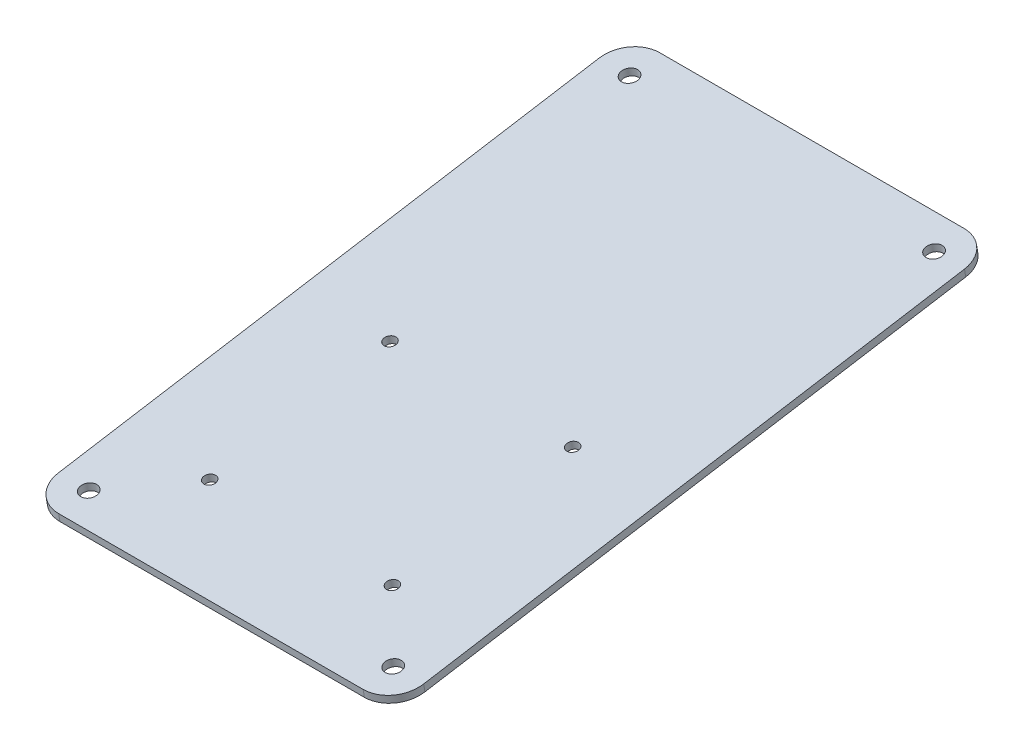
ISO-10303-21;
HEADER;
FILE_DESCRIPTION(('STEP AP214'),'2;1');
FILE_NAME('part.step','',(''),(''),'','','');
FILE_SCHEMA(('AUTOMOTIVE_DESIGN { 1 0 10303 214 1 1 1 1 }'));
ENDSEC;
DATA;
#1=APPLICATION_CONTEXT('core data for automotive mechanical design processes');
#2=APPLICATION_PROTOCOL_DEFINITION('international standard','automotive_design',2000,#1);
#3=PRODUCT_CONTEXT('',#1,'mechanical');
#4=PRODUCT('Part','Part','',(#3));
#5=PRODUCT_RELATED_PRODUCT_CATEGORY('part','',(#4));
#6=PRODUCT_DEFINITION_FORMATION('','',#4);
#7=PRODUCT_DEFINITION_CONTEXT('part definition',#1,'design');
#8=PRODUCT_DEFINITION('design','',#6,#7);
#9=PRODUCT_DEFINITION_SHAPE('','',#8);
#10=(LENGTH_UNIT() NAMED_UNIT(*) SI_UNIT(.MILLI.,.METRE.));
#11=(NAMED_UNIT(*) PLANE_ANGLE_UNIT() SI_UNIT($,.RADIAN.));
#12=(NAMED_UNIT(*) SI_UNIT($,.STERADIAN.) SOLID_ANGLE_UNIT());
#13=UNCERTAINTY_MEASURE_WITH_UNIT(LENGTH_MEASURE(1.E-05),#10,'distance_accuracy_value','');
#14=(GEOMETRIC_REPRESENTATION_CONTEXT(3) GLOBAL_UNCERTAINTY_ASSIGNED_CONTEXT((#13)) GLOBAL_UNIT_ASSIGNED_CONTEXT((#10,
#11,#12)) REPRESENTATION_CONTEXT('',''));
#15=CARTESIAN_POINT('',(0.,0.,0.));
#16=DIRECTION('',(0.,0.,1.));
#17=DIRECTION('',(1.,0.,0.));
#18=AXIS2_PLACEMENT_3D('',#15,#16,#17);
#19=CARTESIAN_POINT('',(63.499999999944,538.348106001962,1040.2545539791));
#20=DIRECTION('',(0.,-0.986762512438189,-0.162171958262434));
#21=DIRECTION('',(0.,0.162171958262434,-0.986762512438189));
#22=AXIS2_PLACEMENT_3D('',#19,#20,#21);
#23=CYLINDRICAL_SURFACE('',#22,12.7000000000559);
#24=CARTESIAN_POINT('',(63.499999999944,535.21513502497,1039.73965801161));
#25=DIRECTION('',(0.,0.986762512438189,0.162171958262434));
#26=DIRECTION('',(0.,0.162171958262434,-0.986762512438189));
#27=AXIS2_PLACEMENT_3D('',#24,#25,#26);
#28=CIRCLE('',#27,12.7000000000559);
#29=CARTESIAN_POINT('',(76.1999999999999,535.21513502497,1039.73965801161));
#30=VERTEX_POINT('',#29);
#31=CARTESIAN_POINT('',(63.499999999944,537.274718894912,1027.20777410359));
#32=VERTEX_POINT('',#31);
#33=EDGE_CURVE('E137',#30,#32,#28,.T.);
#34=ORIENTED_EDGE('',*,*,#33,.T.);
#35=DIRECTION('',(0.,-0.986762512438189,-0.162171958262434));
#36=VECTOR('',#35,1.);
#37=CARTESIAN_POINT('',(63.499999999944,540.407689871904,1027.72267007108));
#38=LINE('',#37,#36);
#39=CARTESIAN_POINT('',(63.499999999944,540.407689871904,1027.72267007108));
#40=VERTEX_POINT('',#39);
#41=EDGE_CURVE('E11',#40,#32,#38,.T.);
#42=ORIENTED_EDGE('',*,*,#41,.F.);
#43=CARTESIAN_POINT('',(63.499999999944,538.348106001962,1040.2545539791));
#44=DIRECTION('',(0.,0.986762512438189,0.162171958262434));
#45=DIRECTION('',(0.,0.162171958262434,-0.986762512438189));
#46=AXIS2_PLACEMENT_3D('',#43,#44,#45);
#47=CIRCLE('',#46,12.7000000000559);
#48=CARTESIAN_POINT('',(76.1999999999999,538.348106001962,1040.2545539791));
#49=VERTEX_POINT('',#48);
#50=EDGE_CURVE('E152',#49,#40,#47,.T.);
#51=ORIENTED_EDGE('',*,*,#50,.F.);
#52=DIRECTION('',(0.,-0.986762512438189,-0.162171958262434));
#53=VECTOR('',#52,1.);
#54=CARTESIAN_POINT('',(76.1999999999999,538.348106001962,1040.2545539791));
#55=LINE('',#54,#53);
#56=EDGE_CURVE('E133',#49,#30,#55,.T.);
#57=ORIENTED_EDGE('',*,*,#56,.T.);
#58=EDGE_LOOP('',(#34,#42,#51,#57));
#59=FACE_BOUND('',#58,.T.);
#60=ADVANCED_FACE('F39',(#59),#23,.T.);
#61=CARTESIAN_POINT('',(-63.4999999999442,540.407689871904,1027.72267007108));
#62=DIRECTION('',(0.,-0.162171958262434,0.986762512438189));
#63=DIRECTION('',(0.,-0.986762512438189,-0.162171958262434));
#64=AXIS2_PLACEMENT_3D('',#61,#62,#63);
#65=PLANE('',#64);
#66=DIRECTION('',(-1.,0.,0.));
#67=VECTOR('',#66,1.);
#68=CARTESIAN_POINT('',(-63.4999999999442,537.274718894912,1027.20777410359));
#69=LINE('',#68,#67);
#70=CARTESIAN_POINT('',(-63.4999999999442,537.274718894912,1027.20777410359));
#71=VERTEX_POINT('',#70);
#72=EDGE_CURVE('E140',#32,#71,#69,.T.);
#73=ORIENTED_EDGE('',*,*,#72,.T.);
#74=DIRECTION('',(0.,-0.986762512438189,-0.162171958262434));
#75=VECTOR('',#74,1.);
#76=CARTESIAN_POINT('',(-63.4999999999442,540.407689871904,1027.72267007108));
#77=LINE('',#76,#75);
#78=CARTESIAN_POINT('',(-63.4999999999442,540.407689871904,1027.72267007108));
#79=VERTEX_POINT('',#78);
#80=EDGE_CURVE('E48',#79,#71,#77,.T.);
#81=ORIENTED_EDGE('',*,*,#80,.F.);
#82=DIRECTION('',(-1.,0.,0.));
#83=VECTOR('',#82,1.);
#84=CARTESIAN_POINT('',(-63.4999999999442,540.407689871904,1027.72267007108));
#85=LINE('',#84,#83);
#86=EDGE_CURVE('E100',#40,#79,#85,.T.);
#87=ORIENTED_EDGE('',*,*,#86,.F.);
#88=ORIENTED_EDGE('',*,*,#41,.T.);
#89=EDGE_LOOP('',(#73,#81,#87,#88));
#90=FACE_BOUND('',#89,.T.);
#91=ADVANCED_FACE('F246',(#90),#65,.F.);
#92=CARTESIAN_POINT('',(-63.4999999999442,538.348106001962,1040.2545539791));
#93=DIRECTION('',(0.,-0.986762512438189,-0.162171958262434));
#94=DIRECTION('',(0.,0.162171958262434,-0.986762512438189));
#95=AXIS2_PLACEMENT_3D('',#92,#93,#94);
#96=CYLINDRICAL_SURFACE('',#95,12.7000000000559);
#97=CARTESIAN_POINT('',(-63.4999999999442,535.215135024971,1039.73965801161));
#98=DIRECTION('',(0.,0.986762512438189,0.162171958262434));
#99=DIRECTION('',(0.,0.162171958262434,-0.986762512438189));
#100=AXIS2_PLACEMENT_3D('',#97,#98,#99);
#101=CIRCLE('',#100,12.7000000000559);
#102=CARTESIAN_POINT('',(-76.2000000000001,535.215135024971,1039.73965801161));
#103=VERTEX_POINT('',#102);
#104=EDGE_CURVE('E143',#71,#103,#101,.T.);
#105=ORIENTED_EDGE('',*,*,#104,.T.);
#106=DIRECTION('',(0.,-0.986762512438189,-0.162171958262434));
#107=VECTOR('',#106,1.);
#108=CARTESIAN_POINT('',(-76.2000000000001,538.348106001962,1040.2545539791));
#109=LINE('',#108,#107);
#110=CARTESIAN_POINT('',(-76.2000000000001,538.348106001962,1040.2545539791));
#111=VERTEX_POINT('',#110);
#112=EDGE_CURVE('E159',#111,#103,#109,.T.);
#113=ORIENTED_EDGE('',*,*,#112,.F.);
#114=CARTESIAN_POINT('',(-63.4999999999442,538.348106001962,1040.2545539791));
#115=DIRECTION('',(0.,0.986762512438189,0.162171958262434));
#116=DIRECTION('',(0.,0.162171958262434,-0.986762512438189));
#117=AXIS2_PLACEMENT_3D('',#114,#115,#116);
#118=CIRCLE('',#117,12.7000000000559);
#119=EDGE_CURVE('E213',#79,#111,#118,.T.);
#120=ORIENTED_EDGE('',*,*,#119,.F.);
#121=ORIENTED_EDGE('',*,*,#80,.T.);
#122=EDGE_LOOP('',(#105,#113,#120,#121));
#123=FACE_BOUND('',#122,.T.);
#124=ADVANCED_FACE('F250',(#123),#96,.T.);
#125=CARTESIAN_POINT('',(-76.2000000000001,501.275596343188,1265.82846432236));
#126=DIRECTION('',(1.,0.,0.));
#127=DIRECTION('',(0.,1.,0.));
#128=AXIS2_PLACEMENT_3D('',#125,#126,#127);
#129=PLANE('',#128);
#130=DIRECTION('',(0.,-0.162171958262434,0.986762512438189));
#131=VECTOR('',#130,1.);
#132=CARTESIAN_POINT('',(-76.2000000000001,498.142625366196,1265.31356835487));
#133=LINE('',#132,#131);
#134=CARTESIAN_POINT('',(-76.2000000000001,498.142625366196,1265.31356835487));
#135=VERTEX_POINT('',#134);
#136=EDGE_CURVE('E145',#103,#135,#133,.T.);
#137=ORIENTED_EDGE('',*,*,#136,.T.);
#138=DIRECTION('',(0.,-0.986762512438189,-0.162171958262434));
#139=VECTOR('',#138,1.);
#140=CARTESIAN_POINT('',(-76.2000000000001,501.275596343188,1265.82846432236));
#141=LINE('',#140,#139);
#142=CARTESIAN_POINT('',(-76.2000000000001,501.275596343188,1265.82846432236));
#143=VERTEX_POINT('',#142);
#144=EDGE_CURVE('E156',#143,#135,#141,.T.);
#145=ORIENTED_EDGE('',*,*,#144,.F.);
#146=DIRECTION('',(0.,-0.162171958262434,0.986762512438189));
#147=VECTOR('',#146,1.);
#148=CARTESIAN_POINT('',(-76.2000000000001,501.275596343188,1265.82846432236));
#149=LINE('',#148,#147);
#150=EDGE_CURVE('E215',#111,#143,#149,.T.);
#151=ORIENTED_EDGE('',*,*,#150,.F.);
#152=ORIENTED_EDGE('',*,*,#112,.T.);
#153=EDGE_LOOP('',(#137,#145,#151,#152));
#154=FACE_BOUND('',#153,.T.);
#155=ADVANCED_FACE('F221',(#154),#129,.F.);
#156=CARTESIAN_POINT('',(-63.4999999999442,501.275596343188,1265.82846432236));
#157=DIRECTION('',(0.,-0.986762512438189,-0.162171958262434));
#158=DIRECTION('',(0.,0.162171958262434,-0.986762512438189));
#159=AXIS2_PLACEMENT_3D('',#156,#157,#158);
#160=CYLINDRICAL_SURFACE('',#159,12.7000000000559);
#161=CARTESIAN_POINT('',(-63.4999999999442,498.142625366196,1265.31356835487));
#162=DIRECTION('',(0.,0.986762512438189,0.162171958262434));
#163=DIRECTION('',(0.,-0.162171958262434,0.986762512438189));
#164=AXIS2_PLACEMENT_3D('',#161,#162,#163);
#165=CIRCLE('',#164,12.7000000000559);
#166=CARTESIAN_POINT('',(-63.4999999999442,496.083041496254,1277.84545226289));
#167=VERTEX_POINT('',#166);
#168=EDGE_CURVE('E147',#135,#167,#165,.T.);
#169=ORIENTED_EDGE('',*,*,#168,.T.);
#170=DIRECTION('',(0.,-0.986762512438189,-0.162171958262434));
#171=VECTOR('',#170,1.);
#172=CARTESIAN_POINT('',(-63.4999999999442,499.216012473246,1278.36034823038));
#173=LINE('',#172,#171);
#174=CARTESIAN_POINT('',(-63.4999999999442,499.216012473246,1278.36034823038));
#175=VERTEX_POINT('',#174);
#176=EDGE_CURVE('E128',#175,#167,#173,.T.);
#177=ORIENTED_EDGE('',*,*,#176,.F.);
#178=CARTESIAN_POINT('',(-63.4999999999442,501.275596343188,1265.82846432236));
#179=DIRECTION('',(0.,0.986762512438189,0.162171958262434));
#180=DIRECTION('',(0.,-0.162171958262434,0.986762512438189));
#181=AXIS2_PLACEMENT_3D('',#178,#179,#180);
#182=CIRCLE('',#181,12.7000000000559);
#183=EDGE_CURVE('E119',#143,#175,#182,.T.);
#184=ORIENTED_EDGE('',*,*,#183,.F.);
#185=ORIENTED_EDGE('',*,*,#144,.T.);
#186=EDGE_LOOP('',(#169,#177,#184,#185));
#187=FACE_BOUND('',#186,.T.);
#188=ADVANCED_FACE('F225',(#187),#160,.T.);
#189=CARTESIAN_POINT('',(-63.4999999999442,499.216012473246,1278.36034823038));
#190=DIRECTION('',(0.,0.162171958262434,-0.986762512438189));
#191=DIRECTION('',(0.,0.986762512438189,0.162171958262434));
#192=AXIS2_PLACEMENT_3D('',#189,#190,#191);
#193=PLANE('',#192);
#194=DIRECTION('',(1.,0.,0.));
#195=VECTOR('',#194,1.);
#196=CARTESIAN_POINT('',(-63.4999999999442,496.083041496254,1277.84545226289));
#197=LINE('',#196,#195);
#198=CARTESIAN_POINT('',(63.4999999999439,496.083041496254,1277.84545226289));
#199=VERTEX_POINT('',#198);
#200=EDGE_CURVE('E127',#167,#199,#197,.T.);
#201=ORIENTED_EDGE('',*,*,#200,.T.);
#202=DIRECTION('',(0.,-0.986762512438189,-0.162171958262434));
#203=VECTOR('',#202,1.);
#204=CARTESIAN_POINT('',(63.4999999999439,499.216012473246,1278.36034823038));
#205=LINE('',#204,#203);
#206=CARTESIAN_POINT('',(63.4999999999439,499.216012473246,1278.36034823038));
#207=VERTEX_POINT('',#206);
#208=EDGE_CURVE('E124',#207,#199,#205,.T.);
#209=ORIENTED_EDGE('',*,*,#208,.F.);
#210=DIRECTION('',(1.,0.,0.));
#211=VECTOR('',#210,1.);
#212=CARTESIAN_POINT('',(-63.4999999999442,499.216012473246,1278.36034823038));
#213=LINE('',#212,#211);
#214=EDGE_CURVE('E113',#175,#207,#213,.T.);
#215=ORIENTED_EDGE('',*,*,#214,.F.);
#216=ORIENTED_EDGE('',*,*,#176,.T.);
#217=EDGE_LOOP('',(#201,#209,#215,#216));
#218=FACE_BOUND('',#217,.T.);
#219=ADVANCED_FACE('F125',(#218),#193,.F.);
#220=CARTESIAN_POINT('',(63.4999999999439,501.275596343188,1265.82846432236));
#221=DIRECTION('',(0.,-0.986762512438189,-0.162171958262434));
#222=DIRECTION('',(0.,0.162171958262434,-0.986762512438189));
#223=AXIS2_PLACEMENT_3D('',#220,#221,#222);
#224=CYLINDRICAL_SURFACE('',#223,12.7000000000562);
#225=CARTESIAN_POINT('',(63.4999999999439,498.142625366196,1265.31356835487));
#226=DIRECTION('',(0.,0.986762512438189,0.162171958262434));
#227=DIRECTION('',(0.,0.162171958262434,-0.986762512438189));
#228=AXIS2_PLACEMENT_3D('',#225,#226,#227);
#229=CIRCLE('',#228,12.7000000000562);
#230=CARTESIAN_POINT('',(76.2000000000001,498.142625366196,1265.31356835487));
#231=VERTEX_POINT('',#230);
#232=EDGE_CURVE('E86',#199,#231,#229,.T.);
#233=ORIENTED_EDGE('',*,*,#232,.T.);
#234=DIRECTION('',(0.,-0.986762512438189,-0.162171958262434));
#235=VECTOR('',#234,1.);
#236=CARTESIAN_POINT('',(76.2000000000001,501.275596343188,1265.82846432236));
#237=LINE('',#236,#235);
#238=CARTESIAN_POINT('',(76.2000000000001,501.275596343188,1265.82846432236));
#239=VERTEX_POINT('',#238);
#240=EDGE_CURVE('E129',#239,#231,#237,.T.);
#241=ORIENTED_EDGE('',*,*,#240,.F.);
#242=CARTESIAN_POINT('',(63.4999999999439,501.275596343188,1265.82846432236));
#243=DIRECTION('',(0.,0.986762512438189,0.162171958262434));
#244=DIRECTION('',(0.,0.162171958262434,-0.986762512438189));
#245=AXIS2_PLACEMENT_3D('',#242,#243,#244);
#246=CIRCLE('',#245,12.7000000000562);
#247=EDGE_CURVE('E117',#207,#239,#246,.T.);
#248=ORIENTED_EDGE('',*,*,#247,.F.);
#249=ORIENTED_EDGE('',*,*,#208,.T.);
#250=EDGE_LOOP('',(#233,#241,#248,#249));
#251=FACE_BOUND('',#250,.T.);
#252=ADVANCED_FACE('F131',(#251),#224,.T.);
#253=CARTESIAN_POINT('',(76.1999999999999,501.275596343188,1265.82846432236));
#254=DIRECTION('',(-1.,0.,0.));
#255=DIRECTION('',(0.,-1.,0.));
#256=AXIS2_PLACEMENT_3D('',#253,#254,#255);
#257=PLANE('',#256);
#258=DIRECTION('',(0.,0.162171958262434,-0.986762512438189));
#259=VECTOR('',#258,1.);
#260=CARTESIAN_POINT('',(76.1999999999999,498.142625366196,1265.31356835487));
#261=LINE('',#260,#259);
#262=EDGE_CURVE('E92',#231,#30,#261,.T.);
#263=ORIENTED_EDGE('',*,*,#262,.T.);
#264=ORIENTED_EDGE('',*,*,#56,.F.);
#265=DIRECTION('',(0.,0.162171958262434,-0.986762512438189));
#266=VECTOR('',#265,1.);
#267=CARTESIAN_POINT('',(76.1999999999999,501.275596343188,1265.82846432236));
#268=LINE('',#267,#266);
#269=EDGE_CURVE('E57',#239,#49,#268,.T.);
#270=ORIENTED_EDGE('',*,*,#269,.F.);
#271=ORIENTED_EDGE('',*,*,#240,.T.);
#272=EDGE_LOOP('',(#263,#264,#270,#271));
#273=FACE_BOUND('',#272,.T.);
#274=ADVANCED_FACE('F233',(#273),#257,.F.);
#275=CARTESIAN_POINT('',(63.499999999944,538.348106001962,1040.2545539791));
#276=DIRECTION('',(0.,-0.986762512438189,-0.162171958262434));
#277=DIRECTION('',(0.,0.162171958262434,-0.986762512438189));
#278=AXIS2_PLACEMENT_3D('',#275,#276,#277);
#279=PLANE('',#278);
#280=CARTESIAN_POINT('',(38.1,505.394764083045,1240.76469650648));
#281=DIRECTION('',(0.,0.986762512438189,0.162171958262434));
#282=DIRECTION('',(0.,-0.162171958262434,0.986762512438189));
#283=AXIS2_PLACEMENT_3D('',#280,#281,#282);
#284=CIRCLE('',#283,2.45744999999999);
#285=CARTESIAN_POINT('',(38.1,504.996234604213,1243.18961604267));
#286=VERTEX_POINT('',#285);
#287=EDGE_CURVE('E198',#286,#286,#284,.T.);
#288=ORIENTED_EDGE('',*,*,#287,.F.);
#289=EDGE_LOOP('',(#288));
#290=FACE_BOUND('',#289,.T.);
#291=CARTESIAN_POINT('',(-38.1,505.394764083045,1240.76469650648));
#292=DIRECTION('',(0.,0.986762512438189,0.162171958262434));
#293=DIRECTION('',(0.,-0.162171958262434,0.986762512438189));
#294=AXIS2_PLACEMENT_3D('',#291,#292,#293);
#295=CIRCLE('',#294,2.45744999999999);
#296=CARTESIAN_POINT('',(-38.1,504.996234604213,1243.18961604267));
#297=VERTEX_POINT('',#296);
#298=EDGE_CURVE('E188',#297,#297,#295,.T.);
#299=ORIENTED_EDGE('',*,*,#298,.F.);
#300=EDGE_LOOP('',(#299));
#301=FACE_BOUND('',#300,.T.);
#302=CARTESIAN_POINT('',(38.1,517.752267302643,1165.57339305869));
#303=DIRECTION('',(0.,0.986762512438189,0.162171958262434));
#304=DIRECTION('',(0.,-0.162171958262434,0.986762512438189));
#305=AXIS2_PLACEMENT_3D('',#302,#303,#304);
#306=CIRCLE('',#305,2.45744999999999);
#307=CARTESIAN_POINT('',(38.1,517.353737823811,1167.99831259488));
#308=VERTEX_POINT('',#307);
#309=EDGE_CURVE('E185',#308,#308,#306,.T.);
#310=ORIENTED_EDGE('',*,*,#309,.F.);
#311=EDGE_LOOP('',(#310));
#312=FACE_BOUND('',#311,.T.);
#313=CARTESIAN_POINT('',(-38.1,517.752267302643,1165.57339305869));
#314=DIRECTION('',(0.,0.986762512438189,0.162171958262434));
#315=DIRECTION('',(0.,-0.162171958262434,0.986762512438189));
#316=AXIS2_PLACEMENT_3D('',#313,#314,#315);
#317=CIRCLE('',#316,2.45744999999999);
#318=CARTESIAN_POINT('',(-38.1,517.353737823811,1167.99831259488));
#319=VERTEX_POINT('',#318);
#320=EDGE_CURVE('E182',#319,#319,#317,.T.);
#321=ORIENTED_EDGE('',*,*,#320,.F.);
#322=EDGE_LOOP('',(#321));
#323=FACE_BOUND('',#322,.T.);
#324=CARTESIAN_POINT('',(-63.4999999999439,501.275596343189,1265.82846432235));
#325=DIRECTION('',(0.,0.986762512438189,0.162171958262434));
#326=DIRECTION('',(0.,-0.162171958262434,0.986762512438189));
#327=AXIS2_PLACEMENT_3D('',#324,#325,#326);
#328=CIRCLE('',#327,3.37819999999998);
#329=CARTESIAN_POINT('',(-63.4999999999439,500.727747033787,1269.16194544187));
#330=VERTEX_POINT('',#329);
#331=EDGE_CURVE('E178',#330,#330,#328,.T.);
#332=ORIENTED_EDGE('',*,*,#331,.F.);
#333=EDGE_LOOP('',(#332));
#334=FACE_BOUND('',#333,.T.);
#335=CARTESIAN_POINT('',(63.4999999999439,501.275596343189,1265.82846432235));
#336=DIRECTION('',(0.,0.986762512438189,0.162171958262434));
#337=DIRECTION('',(0.,-0.162171958262434,0.986762512438189));
#338=AXIS2_PLACEMENT_3D('',#335,#336,#337);
#339=CIRCLE('',#338,3.37819999999998);
#340=CARTESIAN_POINT('',(63.4999999999439,500.727747033787,1269.16194544187));
#341=VERTEX_POINT('',#340);
#342=EDGE_CURVE('E174',#341,#341,#339,.T.);
#343=ORIENTED_EDGE('',*,*,#342,.F.);
#344=EDGE_LOOP('',(#343));
#345=FACE_BOUND('',#344,.T.);
#346=CARTESIAN_POINT('',(63.4999999999439,538.348106001963,1040.2545539791));
#347=DIRECTION('',(0.,0.986762512438189,0.162171958262434));
#348=DIRECTION('',(0.,-0.162171958262434,0.986762512438189));
#349=AXIS2_PLACEMENT_3D('',#346,#347,#348);
#350=CIRCLE('',#349,3.37819999999998);
#351=CARTESIAN_POINT('',(63.4999999999439,537.800256692561,1043.58803509861));
#352=VERTEX_POINT('',#351);
#353=EDGE_CURVE('E170',#352,#352,#350,.T.);
#354=ORIENTED_EDGE('',*,*,#353,.F.);
#355=EDGE_LOOP('',(#354));
#356=FACE_BOUND('',#355,.T.);
#357=CARTESIAN_POINT('',(-63.4999999999438,538.348106001963,1040.2545539791));
#358=DIRECTION('',(0.,0.986762512438189,0.162171958262434));
#359=DIRECTION('',(0.,-0.162171958262434,0.986762512438189));
#360=AXIS2_PLACEMENT_3D('',#357,#358,#359);
#361=CIRCLE('',#360,3.37819999999998);
#362=CARTESIAN_POINT('',(-63.4999999999438,537.800256692561,1043.58803509861));
#363=VERTEX_POINT('',#362);
#364=EDGE_CURVE('E166',#363,#363,#361,.T.);
#365=ORIENTED_EDGE('',*,*,#364,.F.);
#366=EDGE_LOOP('',(#365));
#367=FACE_BOUND('',#366,.T.);
#368=ORIENTED_EDGE('',*,*,#50,.T.);
#369=ORIENTED_EDGE('',*,*,#86,.T.);
#370=ORIENTED_EDGE('',*,*,#119,.T.);
#371=ORIENTED_EDGE('',*,*,#150,.T.);
#372=ORIENTED_EDGE('',*,*,#183,.T.);
#373=ORIENTED_EDGE('',*,*,#214,.T.);
#374=ORIENTED_EDGE('',*,*,#247,.T.);
#375=ORIENTED_EDGE('',*,*,#269,.T.);
#376=EDGE_LOOP('',(#368,#369,#370,#371,#372,#373,#374,#375));
#377=FACE_BOUND('',#376,.T.);
#378=ADVANCED_FACE('F115',(#290,#301,#312,#323,#334,#345,#356,#367,#377),#279,.F.);
#379=CARTESIAN_POINT('',(63.499999999944,535.21513502497,1039.73965801161));
#380=DIRECTION('',(0.,-0.986762512438189,-0.162171958262434));
#381=DIRECTION('',(0.,0.162171958262434,-0.986762512438189));
#382=AXIS2_PLACEMENT_3D('',#379,#380,#381);
#383=PLANE('',#382);
#384=CARTESIAN_POINT('',(38.1,502.261793106053,1240.249800539));
#385=DIRECTION('',(0.,-0.986762512438189,-0.162171958262434));
#386=DIRECTION('',(0.,0.162171958262434,-0.986762512438189));
#387=AXIS2_PLACEMENT_3D('',#384,#385,#386);
#388=CIRCLE('',#387,2.45744999999999);
#389=CARTESIAN_POINT('',(38.1,501.863263627221,1242.67472007519));
#390=VERTEX_POINT('',#389);
#391=EDGE_CURVE('E42',#390,#390,#388,.T.);
#392=ORIENTED_EDGE('',*,*,#391,.F.);
#393=EDGE_LOOP('',(#392));
#394=FACE_BOUND('',#393,.T.);
#395=CARTESIAN_POINT('',(-38.1,502.261793106053,1240.249800539));
#396=DIRECTION('',(0.,-0.986762512438189,-0.162171958262434));
#397=DIRECTION('',(0.,0.162171958262434,-0.986762512438189));
#398=AXIS2_PLACEMENT_3D('',#395,#396,#397);
#399=CIRCLE('',#398,2.45744999999999);
#400=CARTESIAN_POINT('',(-38.1,501.863263627221,1242.67472007519));
#401=VERTEX_POINT('',#400);
#402=EDGE_CURVE('E186',#401,#401,#399,.T.);
#403=ORIENTED_EDGE('',*,*,#402,.F.);
#404=EDGE_LOOP('',(#403));
#405=FACE_BOUND('',#404,.T.);
#406=CARTESIAN_POINT('',(38.1,514.619296325651,1165.05849709121));
#407=DIRECTION('',(0.,-0.986762512438189,-0.162171958262434));
#408=DIRECTION('',(0.,0.162171958262434,-0.986762512438189));
#409=AXIS2_PLACEMENT_3D('',#406,#407,#408);
#410=CIRCLE('',#409,2.45744999999999);
#411=CARTESIAN_POINT('',(38.1,514.220766846819,1167.4834166274));
#412=VERTEX_POINT('',#411);
#413=EDGE_CURVE('E183',#412,#412,#410,.T.);
#414=ORIENTED_EDGE('',*,*,#413,.F.);
#415=EDGE_LOOP('',(#414));
#416=FACE_BOUND('',#415,.T.);
#417=CARTESIAN_POINT('',(-38.1,514.619296325651,1165.05849709121));
#418=DIRECTION('',(0.,-0.986762512438189,-0.162171958262434));
#419=DIRECTION('',(0.,0.162171958262434,-0.986762512438189));
#420=AXIS2_PLACEMENT_3D('',#417,#418,#419);
#421=CIRCLE('',#420,2.45744999999999);
#422=CARTESIAN_POINT('',(-38.1,514.220766846819,1167.4834166274));
#423=VERTEX_POINT('',#422);
#424=EDGE_CURVE('E179',#423,#423,#421,.T.);
#425=ORIENTED_EDGE('',*,*,#424,.F.);
#426=EDGE_LOOP('',(#425));
#427=FACE_BOUND('',#426,.T.);
#428=CARTESIAN_POINT('',(-63.4999999999439,498.142625366197,1265.31356835487));
#429=DIRECTION('',(0.,-0.986762512438189,-0.162171958262434));
#430=DIRECTION('',(0.,0.162171958262434,-0.986762512438189));
#431=AXIS2_PLACEMENT_3D('',#428,#429,#430);
#432=CIRCLE('',#431,3.37819999999998);
#433=CARTESIAN_POINT('',(-63.4999999999439,498.690474675599,1261.98008723535));
#434=VERTEX_POINT('',#433);
#435=EDGE_CURVE('E175',#434,#434,#432,.T.);
#436=ORIENTED_EDGE('',*,*,#435,.F.);
#437=EDGE_LOOP('',(#436));
#438=FACE_BOUND('',#437,.T.);
#439=CARTESIAN_POINT('',(63.4999999999439,498.142625366196,1265.31356835487));
#440=DIRECTION('',(0.,-0.986762512438189,-0.162171958262434));
#441=DIRECTION('',(0.,0.162171958262434,-0.986762512438189));
#442=AXIS2_PLACEMENT_3D('',#439,#440,#441);
#443=CIRCLE('',#442,3.37819999999998);
#444=CARTESIAN_POINT('',(63.4999999999439,498.690474675599,1261.98008723535));
#445=VERTEX_POINT('',#444);
#446=EDGE_CURVE('E171',#445,#445,#443,.T.);
#447=ORIENTED_EDGE('',*,*,#446,.F.);
#448=EDGE_LOOP('',(#447));
#449=FACE_BOUND('',#448,.T.);
#450=CARTESIAN_POINT('',(63.4999999999439,535.215135024971,1039.73965801161));
#451=DIRECTION('',(0.,-0.986762512438189,-0.162171958262434));
#452=DIRECTION('',(0.,0.162171958262434,-0.986762512438189));
#453=AXIS2_PLACEMENT_3D('',#450,#451,#452);
#454=CIRCLE('',#453,3.37819999999998);
#455=CARTESIAN_POINT('',(63.4999999999439,535.762984334373,1036.40617689209));
#456=VERTEX_POINT('',#455);
#457=EDGE_CURVE('E167',#456,#456,#454,.T.);
#458=ORIENTED_EDGE('',*,*,#457,.F.);
#459=EDGE_LOOP('',(#458));
#460=FACE_BOUND('',#459,.T.);
#461=CARTESIAN_POINT('',(-63.4999999999438,535.215135024971,1039.73965801161));
#462=DIRECTION('',(0.,-0.986762512438189,-0.162171958262434));
#463=DIRECTION('',(0.,0.162171958262434,-0.986762512438189));
#464=AXIS2_PLACEMENT_3D('',#461,#462,#463);
#465=CIRCLE('',#464,3.37819999999998);
#466=CARTESIAN_POINT('',(-63.4999999999438,535.762984334373,1036.40617689209));
#467=VERTEX_POINT('',#466);
#468=EDGE_CURVE('E141',#467,#467,#465,.T.);
#469=ORIENTED_EDGE('',*,*,#468,.F.);
#470=EDGE_LOOP('',(#469));
#471=FACE_BOUND('',#470,.T.);
#472=ORIENTED_EDGE('',*,*,#33,.F.);
#473=ORIENTED_EDGE('',*,*,#262,.F.);
#474=ORIENTED_EDGE('',*,*,#232,.F.);
#475=ORIENTED_EDGE('',*,*,#200,.F.);
#476=ORIENTED_EDGE('',*,*,#168,.F.);
#477=ORIENTED_EDGE('',*,*,#136,.F.);
#478=ORIENTED_EDGE('',*,*,#104,.F.);
#479=ORIENTED_EDGE('',*,*,#72,.F.);
#480=EDGE_LOOP('',(#472,#473,#474,#475,#476,#477,#478,#479));
#481=FACE_BOUND('',#480,.T.);
#482=ADVANCED_FACE('F228',(#394,#405,#416,#427,#438,#449,#460,#471,#481),#383,.T.);
#483=CARTESIAN_POINT('',(-63.4999999999438,538.348106001963,1040.2545539791));
#484=DIRECTION('',(0.,0.986762512438189,0.162171958262434));
#485=DIRECTION('',(0.,-0.162171958262434,0.986762512438189));
#486=AXIS2_PLACEMENT_3D('',#483,#484,#485);
#487=CYLINDRICAL_SURFACE('',#486,3.37819999999998);
#488=ORIENTED_EDGE('',*,*,#468,.T.);
#489=EDGE_LOOP('',(#488));
#490=FACE_BOUND('',#489,.T.);
#491=ORIENTED_EDGE('',*,*,#364,.T.);
#492=EDGE_LOOP('',(#491));
#493=FACE_BOUND('',#492,.T.);
#494=ADVANCED_FACE('F292',(#490,#493),#487,.F.);
#495=CARTESIAN_POINT('',(63.4999999999439,538.348106001963,1040.2545539791));
#496=DIRECTION('',(0.,0.986762512438189,0.162171958262434));
#497=DIRECTION('',(0.,-0.162171958262434,0.986762512438189));
#498=AXIS2_PLACEMENT_3D('',#495,#496,#497);
#499=CYLINDRICAL_SURFACE('',#498,3.37819999999998);
#500=ORIENTED_EDGE('',*,*,#457,.T.);
#501=EDGE_LOOP('',(#500));
#502=FACE_BOUND('',#501,.T.);
#503=ORIENTED_EDGE('',*,*,#353,.T.);
#504=EDGE_LOOP('',(#503));
#505=FACE_BOUND('',#504,.T.);
#506=ADVANCED_FACE('F301',(#502,#505),#499,.F.);
#507=CARTESIAN_POINT('',(63.4999999999439,501.275596343189,1265.82846432235));
#508=DIRECTION('',(0.,0.986762512438189,0.162171958262434));
#509=DIRECTION('',(0.,-0.162171958262434,0.986762512438189));
#510=AXIS2_PLACEMENT_3D('',#507,#508,#509);
#511=CYLINDRICAL_SURFACE('',#510,3.37819999999998);
#512=ORIENTED_EDGE('',*,*,#446,.T.);
#513=EDGE_LOOP('',(#512));
#514=FACE_BOUND('',#513,.T.);
#515=ORIENTED_EDGE('',*,*,#342,.T.);
#516=EDGE_LOOP('',(#515));
#517=FACE_BOUND('',#516,.T.);
#518=ADVANCED_FACE('F311',(#514,#517),#511,.F.);
#519=CARTESIAN_POINT('',(-63.4999999999439,501.275596343189,1265.82846432235));
#520=DIRECTION('',(0.,0.986762512438189,0.162171958262434));
#521=DIRECTION('',(0.,-0.162171958262434,0.986762512438189));
#522=AXIS2_PLACEMENT_3D('',#519,#520,#521);
#523=CYLINDRICAL_SURFACE('',#522,3.37819999999998);
#524=ORIENTED_EDGE('',*,*,#435,.T.);
#525=EDGE_LOOP('',(#524));
#526=FACE_BOUND('',#525,.T.);
#527=ORIENTED_EDGE('',*,*,#331,.T.);
#528=EDGE_LOOP('',(#527));
#529=FACE_BOUND('',#528,.T.);
#530=ADVANCED_FACE('F321',(#526,#529),#523,.F.);
#531=CARTESIAN_POINT('',(-38.1,517.752267302643,1165.57339305869));
#532=DIRECTION('',(0.,0.986762512438189,0.162171958262434));
#533=DIRECTION('',(0.,-0.162171958262434,0.986762512438189));
#534=AXIS2_PLACEMENT_3D('',#531,#532,#533);
#535=CYLINDRICAL_SURFACE('',#534,2.45744999999999);
#536=CARTESIAN_POINT('',(-38.1,514.220766846819,1167.4834166274));
#537=CARTESIAN_POINT('',(-38.1,514.253401961162,1167.48878012706));
#538=CARTESIAN_POINT('',(-38.1,514.286037075506,1167.49414362672));
#539=CARTESIAN_POINT('',(-38.1,514.351307304193,1167.50487062604));
#540=CARTESIAN_POINT('',(-38.1,514.383942418537,1167.5102341257));
#541=CARTESIAN_POINT('',(-38.1,514.449212647224,1167.52096112503));
#542=CARTESIAN_POINT('',(-38.1,514.481847761568,1167.52632462469));
#543=CARTESIAN_POINT('',(-38.1,514.547117990255,1167.53705162401));
#544=CARTESIAN_POINT('',(-38.1,514.579753104599,1167.54241512367));
#545=CARTESIAN_POINT('',(-38.1,514.645023333286,1167.553142123));
#546=CARTESIAN_POINT('',(-38.1,514.67765844763,1167.55850562266));
#547=CARTESIAN_POINT('',(-38.1,514.742928676317,1167.56923262198));
#548=CARTESIAN_POINT('',(-38.1,514.775563790661,1167.57459612164));
#549=CARTESIAN_POINT('',(-38.1,514.840834019348,1167.58532312096));
#550=CARTESIAN_POINT('',(-38.1,514.873469133692,1167.59068662062));
#551=CARTESIAN_POINT('',(-38.1,514.938739362379,1167.60141361995));
#552=CARTESIAN_POINT('',(-38.1,514.971374476723,1167.60677711961));
#553=CARTESIAN_POINT('',(-38.1,515.03664470541,1167.61750411893));
#554=CARTESIAN_POINT('',(-38.1,515.069279819754,1167.62286761859));
#555=CARTESIAN_POINT('',(-38.1,515.134550048441,1167.63359461791));
#556=CARTESIAN_POINT('',(-38.1,515.167185162785,1167.63895811758));
#557=CARTESIAN_POINT('',(-38.1,515.232455391472,1167.6496851169));
#558=CARTESIAN_POINT('',(-38.1,515.265090505816,1167.65504861656));
#559=CARTESIAN_POINT('',(-38.1,515.330360734503,1167.66577561588));
#560=CARTESIAN_POINT('',(-38.1,515.362995848847,1167.67113911554));
#561=CARTESIAN_POINT('',(-38.1,515.428266077534,1167.68186611487));
#562=CARTESIAN_POINT('',(-38.1,515.460901191878,1167.68722961453));
#563=CARTESIAN_POINT('',(-38.1,515.526171420565,1167.69795661385));
#564=CARTESIAN_POINT('',(-38.1,515.558806534909,1167.70332011351));
#565=CARTESIAN_POINT('',(-38.1,515.624076763596,1167.71404711283));
#566=CARTESIAN_POINT('',(-38.1,515.65671187794,1167.7194106125));
#567=CARTESIAN_POINT('',(-38.1,515.721982106627,1167.73013761182));
#568=CARTESIAN_POINT('',(-38.1,515.754617220971,1167.73550111148));
#569=CARTESIAN_POINT('',(-38.1,515.819887449659,1167.7462281108));
#570=CARTESIAN_POINT('',(-38.1,515.852522564002,1167.75159161046));
#571=CARTESIAN_POINT('',(-38.1,515.91779279269,1167.76231860979));
#572=CARTESIAN_POINT('',(-38.1,515.950427907033,1167.76768210945));
#573=CARTESIAN_POINT('',(-38.1,516.015698135721,1167.77840910877));
#574=CARTESIAN_POINT('',(-38.1,516.048333250064,1167.78377260843));
#575=CARTESIAN_POINT('',(-38.1,516.113603478752,1167.79449960775));
#576=CARTESIAN_POINT('',(-38.1,516.146238593095,1167.79986310741));
#577=CARTESIAN_POINT('',(-38.1,516.211508821783,1167.81059010674));
#578=CARTESIAN_POINT('',(-38.1,516.244143936126,1167.8159536064));
#579=CARTESIAN_POINT('',(-38.1,516.309414164814,1167.82668060572));
#580=CARTESIAN_POINT('',(-38.1,516.342049279157,1167.83204410538));
#581=CARTESIAN_POINT('',(-38.1,516.407319507845,1167.8427711047));
#582=CARTESIAN_POINT('',(-38.1,516.439954622188,1167.84813460437));
#583=CARTESIAN_POINT('',(-38.1,516.505224850876,1167.85886160369));
#584=CARTESIAN_POINT('',(-38.1,516.537859965219,1167.86422510335));
#585=CARTESIAN_POINT('',(-38.1,516.603130193907,1167.87495210267));
#586=CARTESIAN_POINT('',(-38.1,516.63576530825,1167.88031560233));
#587=CARTESIAN_POINT('',(-38.1,516.701035536938,1167.89104260166));
#588=CARTESIAN_POINT('',(-38.1,516.733670651281,1167.89640610132));
#589=CARTESIAN_POINT('',(-38.1,516.798940879969,1167.90713310064));
#590=CARTESIAN_POINT('',(-38.1,516.831575994312,1167.9124966003));
#591=CARTESIAN_POINT('',(-38.1,516.896846223,1167.92322359962));
#592=CARTESIAN_POINT('',(-38.1,516.929481337343,1167.92858709929));
#593=CARTESIAN_POINT('',(-38.1,516.994751566031,1167.93931409861));
#594=CARTESIAN_POINT('',(-38.1,517.027386680374,1167.94467759827));
#595=CARTESIAN_POINT('',(-38.1,517.092656909062,1167.95540459759));
#596=CARTESIAN_POINT('',(-38.1,517.125292023405,1167.96076809725));
#597=CARTESIAN_POINT('',(-38.1,517.190562252093,1167.97149509658));
#598=CARTESIAN_POINT('',(-38.1,517.223197366436,1167.97685859624));
#599=CARTESIAN_POINT('',(-38.1,517.288467595124,1167.98758559556));
#600=CARTESIAN_POINT('',(-38.1,517.321102709467,1167.99294909522));
#601=CARTESIAN_POINT('',(-38.1,517.353737823811,1167.99831259488));
#602=B_SPLINE_CURVE_WITH_KNOTS('',3,(#536,#537,#538,#539,#540,#541,#542,#543,#544,#545,#546,
#547,#548,#549,#550,#551,#552,#553,#554,#555,#556,#557,#558,#559,#560,#561,#562,#563,#564,#565,
#566,#567,#568,#569,#570,#571,#572,#573,#574,#575,#576,#577,#578,#579,#580,#581,#582,#583,#584,
#585,#586,#587,#588,#589,#590,#591,#592,#593,#594,#595,#596,#597,#598,#599,#600,#601),
.UNSPECIFIED.,.F.,.F.,(4,2,2,2,2,2,2,2,2,2,2,2,2,2,2,2,2,2,2,2,2,2,2,2,2,2,2,2,2,2,2,2,4),(0.,
0.0992187500000293,0.198437500000059,0.297656250000088,0.396875000000117,0.496093750000146,
0.595312500000176,0.694531250000205,0.793750000000198,0.892968750000228,0.992187500000257,
1.09140625000029,1.19062500000032,1.28984375000034,1.38906250000037,1.4882812500004,
1.58750000000054,1.68671875000057,1.78593750000056,1.88515625000059,1.98437500000062,
2.08359375000065,2.18281250000068,2.28203125000071,2.38125000000074,2.48046875000077,
2.5796875000008,2.67890625000083,2.77812500000082,2.87734375000085,2.97656250000088,
3.07578125000091,3.17500000000105),.UNSPECIFIED.);
#603=EDGE_CURVE('BSEAM330',#423,#319,#602,.T.);
#604=ORIENTED_EDGE('',*,*,#424,.T.);
#605=ORIENTED_EDGE('',*,*,#320,.T.);
#606=ORIENTED_EDGE('',*,*,#603,.T.);
#607=ORIENTED_EDGE('',*,*,#603,.F.);
#608=EDGE_LOOP('',(#604,#606,#605,#607));
#609=FACE_BOUND('',#608,.T.);
#610=ADVANCED_FACE('F330',(#609),#535,.F.);
#611=CARTESIAN_POINT('',(38.1,517.752267302643,1165.57339305869));
#612=DIRECTION('',(0.,0.986762512438189,0.162171958262434));
#613=DIRECTION('',(0.,-0.162171958262434,0.986762512438189));
#614=AXIS2_PLACEMENT_3D('',#611,#612,#613);
#615=CYLINDRICAL_SURFACE('',#614,2.45744999999999);
#616=CARTESIAN_POINT('',(38.1,514.220766846819,1167.4834166274));
#617=CARTESIAN_POINT('',(38.1,514.253401961162,1167.48878012706));
#618=CARTESIAN_POINT('',(38.1,514.286037075506,1167.49414362672));
#619=CARTESIAN_POINT('',(38.1,514.351307304193,1167.50487062604));
#620=CARTESIAN_POINT('',(38.1,514.383942418537,1167.5102341257));
#621=CARTESIAN_POINT('',(38.1,514.449212647224,1167.52096112503));
#622=CARTESIAN_POINT('',(38.1,514.481847761568,1167.52632462469));
#623=CARTESIAN_POINT('',(38.1,514.547117990255,1167.53705162401));
#624=CARTESIAN_POINT('',(38.1,514.579753104599,1167.54241512367));
#625=CARTESIAN_POINT('',(38.1,514.645023333286,1167.553142123));
#626=CARTESIAN_POINT('',(38.1,514.67765844763,1167.55850562266));
#627=CARTESIAN_POINT('',(38.1,514.742928676317,1167.56923262198));
#628=CARTESIAN_POINT('',(38.1,514.775563790661,1167.57459612164));
#629=CARTESIAN_POINT('',(38.1,514.840834019348,1167.58532312096));
#630=CARTESIAN_POINT('',(38.1,514.873469133692,1167.59068662062));
#631=CARTESIAN_POINT('',(38.1,514.938739362379,1167.60141361995));
#632=CARTESIAN_POINT('',(38.1,514.971374476723,1167.60677711961));
#633=CARTESIAN_POINT('',(38.1,515.03664470541,1167.61750411893));
#634=CARTESIAN_POINT('',(38.1,515.069279819754,1167.62286761859));
#635=CARTESIAN_POINT('',(38.1,515.134550048441,1167.63359461791));
#636=CARTESIAN_POINT('',(38.1,515.167185162785,1167.63895811758));
#637=CARTESIAN_POINT('',(38.1,515.232455391472,1167.6496851169));
#638=CARTESIAN_POINT('',(38.1,515.265090505816,1167.65504861656));
#639=CARTESIAN_POINT('',(38.1,515.330360734503,1167.66577561588));
#640=CARTESIAN_POINT('',(38.1,515.362995848847,1167.67113911554));
#641=CARTESIAN_POINT('',(38.1,515.428266077534,1167.68186611487));
#642=CARTESIAN_POINT('',(38.1,515.460901191878,1167.68722961453));
#643=CARTESIAN_POINT('',(38.1,515.526171420565,1167.69795661385));
#644=CARTESIAN_POINT('',(38.1,515.558806534909,1167.70332011351));
#645=CARTESIAN_POINT('',(38.1,515.624076763596,1167.71404711283));
#646=CARTESIAN_POINT('',(38.1,515.65671187794,1167.7194106125));
#647=CARTESIAN_POINT('',(38.1,515.721982106627,1167.73013761182));
#648=CARTESIAN_POINT('',(38.1,515.754617220971,1167.73550111148));
#649=CARTESIAN_POINT('',(38.1,515.819887449659,1167.7462281108));
#650=CARTESIAN_POINT('',(38.1,515.852522564002,1167.75159161046));
#651=CARTESIAN_POINT('',(38.1,515.91779279269,1167.76231860979));
#652=CARTESIAN_POINT('',(38.1,515.950427907033,1167.76768210945));
#653=CARTESIAN_POINT('',(38.1,516.015698135721,1167.77840910877));
#654=CARTESIAN_POINT('',(38.1,516.048333250064,1167.78377260843));
#655=CARTESIAN_POINT('',(38.1,516.113603478752,1167.79449960775));
#656=CARTESIAN_POINT('',(38.1,516.146238593095,1167.79986310741));
#657=CARTESIAN_POINT('',(38.1,516.211508821783,1167.81059010674));
#658=CARTESIAN_POINT('',(38.1,516.244143936126,1167.8159536064));
#659=CARTESIAN_POINT('',(38.1,516.309414164814,1167.82668060572));
#660=CARTESIAN_POINT('',(38.1,516.342049279157,1167.83204410538));
#661=CARTESIAN_POINT('',(38.1,516.407319507845,1167.8427711047));
#662=CARTESIAN_POINT('',(38.1,516.439954622188,1167.84813460437));
#663=CARTESIAN_POINT('',(38.1,516.505224850876,1167.85886160369));
#664=CARTESIAN_POINT('',(38.1,516.537859965219,1167.86422510335));
#665=CARTESIAN_POINT('',(38.1,516.603130193907,1167.87495210267));
#666=CARTESIAN_POINT('',(38.1,516.63576530825,1167.88031560233));
#667=CARTESIAN_POINT('',(38.1,516.701035536938,1167.89104260166));
#668=CARTESIAN_POINT('',(38.1,516.733670651281,1167.89640610132));
#669=CARTESIAN_POINT('',(38.1,516.798940879969,1167.90713310064));
#670=CARTESIAN_POINT('',(38.1,516.831575994312,1167.9124966003));
#671=CARTESIAN_POINT('',(38.1,516.896846223,1167.92322359962));
#672=CARTESIAN_POINT('',(38.1,516.929481337343,1167.92858709929));
#673=CARTESIAN_POINT('',(38.1,516.994751566031,1167.93931409861));
#674=CARTESIAN_POINT('',(38.1,517.027386680374,1167.94467759827));
#675=CARTESIAN_POINT('',(38.1,517.092656909062,1167.95540459759));
#676=CARTESIAN_POINT('',(38.1,517.125292023405,1167.96076809725));
#677=CARTESIAN_POINT('',(38.1,517.190562252093,1167.97149509658));
#678=CARTESIAN_POINT('',(38.1,517.223197366436,1167.97685859624));
#679=CARTESIAN_POINT('',(38.1,517.288467595124,1167.98758559556));
#680=CARTESIAN_POINT('',(38.1,517.321102709467,1167.99294909522));
#681=CARTESIAN_POINT('',(38.1,517.353737823811,1167.99831259488));
#682=B_SPLINE_CURVE_WITH_KNOTS('',3,(#616,#617,#618,#619,#620,#621,#622,#623,#624,#625,#626,
#627,#628,#629,#630,#631,#632,#633,#634,#635,#636,#637,#638,#639,#640,#641,#642,#643,#644,#645,
#646,#647,#648,#649,#650,#651,#652,#653,#654,#655,#656,#657,#658,#659,#660,#661,#662,#663,#664,
#665,#666,#667,#668,#669,#670,#671,#672,#673,#674,#675,#676,#677,#678,#679,#680,#681),
.UNSPECIFIED.,.F.,.F.,(4,2,2,2,2,2,2,2,2,2,2,2,2,2,2,2,2,2,2,2,2,2,2,2,2,2,2,2,2,2,2,2,4),(0.,
0.0992187500000293,0.198437500000059,0.297656250000088,0.396875000000117,0.496093750000146,
0.595312500000176,0.694531250000205,0.793750000000198,0.892968750000228,0.992187500000257,
1.09140625000029,1.19062500000032,1.28984375000034,1.38906250000037,1.4882812500004,
1.58750000000054,1.68671875000057,1.78593750000056,1.88515625000059,1.98437500000062,
2.08359375000065,2.18281250000068,2.28203125000071,2.38125000000074,2.48046875000077,
2.5796875000008,2.67890625000083,2.77812500000082,2.87734375000085,2.97656250000088,
3.07578125000091,3.17500000000105),.UNSPECIFIED.);
#683=EDGE_CURVE('BSEAM339',#412,#308,#682,.T.);
#684=ORIENTED_EDGE('',*,*,#413,.T.);
#685=ORIENTED_EDGE('',*,*,#309,.T.);
#686=ORIENTED_EDGE('',*,*,#683,.T.);
#687=ORIENTED_EDGE('',*,*,#683,.F.);
#688=EDGE_LOOP('',(#684,#686,#685,#687));
#689=FACE_BOUND('',#688,.T.);
#690=ADVANCED_FACE('F339',(#689),#615,.F.);
#691=CARTESIAN_POINT('',(-38.1,505.394764083045,1240.76469650648));
#692=DIRECTION('',(0.,0.986762512438189,0.162171958262434));
#693=DIRECTION('',(0.,-0.162171958262434,0.986762512438189));
#694=AXIS2_PLACEMENT_3D('',#691,#692,#693);
#695=CYLINDRICAL_SURFACE('',#694,2.45744999999999);
#696=CARTESIAN_POINT('',(-38.1,501.863263627221,1242.67472007519));
#697=CARTESIAN_POINT('',(-38.1,501.895898741565,1242.68008357485));
#698=CARTESIAN_POINT('',(-38.1,501.928533855909,1242.68544707451));
#699=CARTESIAN_POINT('',(-38.1,501.993804084596,1242.69617407383));
#700=CARTESIAN_POINT('',(-38.1,502.02643919894,1242.70153757349));
#701=CARTESIAN_POINT('',(-38.1,502.091709427627,1242.71226457282));
#702=CARTESIAN_POINT('',(-38.1,502.124344541971,1242.71762807248));
#703=CARTESIAN_POINT('',(-38.1,502.189614770658,1242.7283550718));
#704=CARTESIAN_POINT('',(-38.1,502.222249885002,1242.73371857146));
#705=CARTESIAN_POINT('',(-38.1,502.287520113689,1242.74444557079));
#706=CARTESIAN_POINT('',(-38.1,502.320155228033,1242.74980907045));
#707=CARTESIAN_POINT('',(-38.1,502.38542545672,1242.76053606977));
#708=CARTESIAN_POINT('',(-38.1,502.418060571064,1242.76589956943));
#709=CARTESIAN_POINT('',(-38.1,502.483330799751,1242.77662656875));
#710=CARTESIAN_POINT('',(-38.1,502.515965914095,1242.78199006841));
#711=CARTESIAN_POINT('',(-38.1,502.581236142782,1242.79271706774));
#712=CARTESIAN_POINT('',(-38.1,502.613871257126,1242.7980805674));
#713=CARTESIAN_POINT('',(-38.1,502.679141485813,1242.80880756672));
#714=CARTESIAN_POINT('',(-38.1,502.711776600157,1242.81417106638));
#715=CARTESIAN_POINT('',(-38.1,502.777046828844,1242.8248980657));
#716=CARTESIAN_POINT('',(-38.1,502.809681943188,1242.83026156537));
#717=CARTESIAN_POINT('',(-38.1,502.874952171875,1242.84098856469));
#718=CARTESIAN_POINT('',(-38.1,502.907587286219,1242.84635206435));
#719=CARTESIAN_POINT('',(-38.1,502.972857514906,1242.85707906367));
#720=CARTESIAN_POINT('',(-38.1,503.00549262925,1242.86244256333));
#721=CARTESIAN_POINT('',(-38.1,503.070762857937,1242.87316956266));
#722=CARTESIAN_POINT('',(-38.1,503.103397972281,1242.87853306232));
#723=CARTESIAN_POINT('',(-38.1,503.168668200968,1242.88926006164));
#724=CARTESIAN_POINT('',(-38.1,503.201303315312,1242.8946235613));
#725=CARTESIAN_POINT('',(-38.1,503.266573543999,1242.90535056062));
#726=CARTESIAN_POINT('',(-38.1,503.299208658343,1242.91071406028));
#727=CARTESIAN_POINT('',(-38.1,503.36447888703,1242.92144105961));
#728=CARTESIAN_POINT('',(-38.1,503.397114001374,1242.92680455927));
#729=CARTESIAN_POINT('',(-38.1,503.462384230061,1242.93753155859));
#730=CARTESIAN_POINT('',(-38.1,503.495019344405,1242.94289505825));
#731=CARTESIAN_POINT('',(-38.1,503.560289573092,1242.95362205758));
#732=CARTESIAN_POINT('',(-38.1,503.592924687436,1242.95898555724));
#733=CARTESIAN_POINT('',(-38.1,503.658194916123,1242.96971255656));
#734=CARTESIAN_POINT('',(-38.1,503.690830030467,1242.97507605622));
#735=CARTESIAN_POINT('',(-38.1,503.756100259154,1242.98580305554));
#736=CARTESIAN_POINT('',(-38.1,503.788735373498,1242.9911665552));
#737=CARTESIAN_POINT('',(-38.1,503.854005602185,1243.00189355453));
#738=CARTESIAN_POINT('',(-38.1,503.886640716529,1243.00725705419));
#739=CARTESIAN_POINT('',(-38.1,503.951910945216,1243.01798405351));
#740=CARTESIAN_POINT('',(-38.1,503.98454605956,1243.02334755317));
#741=CARTESIAN_POINT('',(-38.1,504.049816288247,1243.03407455249));
#742=CARTESIAN_POINT('',(-38.1,504.082451402591,1243.03943805216));
#743=CARTESIAN_POINT('',(-38.1,504.147721631278,1243.05016505148));
#744=CARTESIAN_POINT('',(-38.1,504.180356745622,1243.05552855114));
#745=CARTESIAN_POINT('',(-38.1,504.245626974309,1243.06625555046));
#746=CARTESIAN_POINT('',(-38.1,504.278262088653,1243.07161905012));
#747=CARTESIAN_POINT('',(-38.1,504.34353231734,1243.08234604945));
#748=CARTESIAN_POINT('',(-38.1,504.376167431684,1243.08770954911));
#749=CARTESIAN_POINT('',(-38.1,504.441437660371,1243.09843654843));
#750=CARTESIAN_POINT('',(-38.1,504.474072774715,1243.10380004809));
#751=CARTESIAN_POINT('',(-38.1,504.539343003402,1243.11452704741));
#752=CARTESIAN_POINT('',(-38.1,504.571978117746,1243.11989054707));
#753=CARTESIAN_POINT('',(-38.1,504.637248346433,1243.1306175464));
#754=CARTESIAN_POINT('',(-38.1,504.669883460777,1243.13598104606));
#755=CARTESIAN_POINT('',(-38.1,504.735153689464,1243.14670804538));
#756=CARTESIAN_POINT('',(-38.1,504.767788803808,1243.15207154504));
#757=CARTESIAN_POINT('',(-38.1,504.833059032495,1243.16279854437));
#758=CARTESIAN_POINT('',(-38.1,504.865694146839,1243.16816204403));
#759=CARTESIAN_POINT('',(-38.1,504.930964375526,1243.17888904335));
#760=CARTESIAN_POINT('',(-38.1,504.96359948987,1243.18425254301));
#761=CARTESIAN_POINT('',(-38.1,504.996234604213,1243.18961604267));
#762=B_SPLINE_CURVE_WITH_KNOTS('',3,(#696,#697,#698,#699,#700,#701,#702,#703,#704,#705,#706,
#707,#708,#709,#710,#711,#712,#713,#714,#715,#716,#717,#718,#719,#720,#721,#722,#723,#724,#725,
#726,#727,#728,#729,#730,#731,#732,#733,#734,#735,#736,#737,#738,#739,#740,#741,#742,#743,#744,
#745,#746,#747,#748,#749,#750,#751,#752,#753,#754,#755,#756,#757,#758,#759,#760,#761),
.UNSPECIFIED.,.F.,.F.,(4,2,2,2,2,2,2,2,2,2,2,2,2,2,2,2,2,2,2,2,2,2,2,2,2,2,2,2,2,2,2,2,4),(0.,
0.0992187500001388,0.198437500000168,0.297656250000197,0.396875000000227,0.496093750000256,
0.595312500000285,0.694531250000315,0.793750000000344,0.892968750000337,0.992187500000366,
1.0914062500004,1.19062500000042,1.28984375000045,1.38906250000048,1.48828125000051,
1.58750000000054,1.68671875000057,1.78593750000056,1.88515625000059,1.98437500000062,
2.08359375000065,2.18281250000068,2.28203125000071,2.38125000000074,2.48046875000077,
2.5796875000008,2.67890625000083,2.77812500000082,2.87734375000085,2.97656250000088,
3.07578125000091,3.17500000000105),.UNSPECIFIED.);
#763=EDGE_CURVE('BSEAM349',#401,#297,#762,.T.);
#764=ORIENTED_EDGE('',*,*,#402,.T.);
#765=ORIENTED_EDGE('',*,*,#298,.T.);
#766=ORIENTED_EDGE('',*,*,#763,.T.);
#767=ORIENTED_EDGE('',*,*,#763,.F.);
#768=EDGE_LOOP('',(#764,#766,#765,#767));
#769=FACE_BOUND('',#768,.T.);
#770=ADVANCED_FACE('F349',(#769),#695,.F.);
#771=CARTESIAN_POINT('',(38.1,505.394764083045,1240.76469650648));
#772=DIRECTION('',(0.,0.986762512438189,0.162171958262434));
#773=DIRECTION('',(0.,-0.162171958262434,0.986762512438189));
#774=AXIS2_PLACEMENT_3D('',#771,#772,#773);
#775=CYLINDRICAL_SURFACE('',#774,2.45744999999999);
#776=CARTESIAN_POINT('',(38.1,501.863263627221,1242.67472007519));
#777=CARTESIAN_POINT('',(38.1,501.895898741565,1242.68008357485));
#778=CARTESIAN_POINT('',(38.1,501.928533855909,1242.68544707451));
#779=CARTESIAN_POINT('',(38.1,501.993804084596,1242.69617407383));
#780=CARTESIAN_POINT('',(38.1,502.02643919894,1242.70153757349));
#781=CARTESIAN_POINT('',(38.1,502.091709427627,1242.71226457282));
#782=CARTESIAN_POINT('',(38.1,502.124344541971,1242.71762807248));
#783=CARTESIAN_POINT('',(38.1,502.189614770658,1242.7283550718));
#784=CARTESIAN_POINT('',(38.1,502.222249885002,1242.73371857146));
#785=CARTESIAN_POINT('',(38.1,502.287520113689,1242.74444557079));
#786=CARTESIAN_POINT('',(38.1,502.320155228033,1242.74980907045));
#787=CARTESIAN_POINT('',(38.1,502.38542545672,1242.76053606977));
#788=CARTESIAN_POINT('',(38.1,502.418060571064,1242.76589956943));
#789=CARTESIAN_POINT('',(38.1,502.483330799751,1242.77662656875));
#790=CARTESIAN_POINT('',(38.1,502.515965914095,1242.78199006841));
#791=CARTESIAN_POINT('',(38.1,502.581236142782,1242.79271706774));
#792=CARTESIAN_POINT('',(38.1,502.613871257126,1242.7980805674));
#793=CARTESIAN_POINT('',(38.1,502.679141485813,1242.80880756672));
#794=CARTESIAN_POINT('',(38.1,502.711776600157,1242.81417106638));
#795=CARTESIAN_POINT('',(38.1,502.777046828844,1242.8248980657));
#796=CARTESIAN_POINT('',(38.1,502.809681943188,1242.83026156537));
#797=CARTESIAN_POINT('',(38.1,502.874952171875,1242.84098856469));
#798=CARTESIAN_POINT('',(38.1,502.907587286219,1242.84635206435));
#799=CARTESIAN_POINT('',(38.1,502.972857514906,1242.85707906367));
#800=CARTESIAN_POINT('',(38.1,503.00549262925,1242.86244256333));
#801=CARTESIAN_POINT('',(38.1,503.070762857937,1242.87316956266));
#802=CARTESIAN_POINT('',(38.1,503.103397972281,1242.87853306232));
#803=CARTESIAN_POINT('',(38.1,503.168668200968,1242.88926006164));
#804=CARTESIAN_POINT('',(38.1,503.201303315312,1242.8946235613));
#805=CARTESIAN_POINT('',(38.1,503.266573543999,1242.90535056062));
#806=CARTESIAN_POINT('',(38.1,503.299208658343,1242.91071406028));
#807=CARTESIAN_POINT('',(38.1,503.36447888703,1242.92144105961));
#808=CARTESIAN_POINT('',(38.1,503.397114001374,1242.92680455927));
#809=CARTESIAN_POINT('',(38.1,503.462384230061,1242.93753155859));
#810=CARTESIAN_POINT('',(38.1,503.495019344405,1242.94289505825));
#811=CARTESIAN_POINT('',(38.1,503.560289573092,1242.95362205758));
#812=CARTESIAN_POINT('',(38.1,503.592924687436,1242.95898555724));
#813=CARTESIAN_POINT('',(38.1,503.658194916123,1242.96971255656));
#814=CARTESIAN_POINT('',(38.1,503.690830030467,1242.97507605622));
#815=CARTESIAN_POINT('',(38.1,503.756100259154,1242.98580305554));
#816=CARTESIAN_POINT('',(38.1,503.788735373498,1242.9911665552));
#817=CARTESIAN_POINT('',(38.1,503.854005602185,1243.00189355453));
#818=CARTESIAN_POINT('',(38.1,503.886640716529,1243.00725705419));
#819=CARTESIAN_POINT('',(38.1,503.951910945216,1243.01798405351));
#820=CARTESIAN_POINT('',(38.1,503.98454605956,1243.02334755317));
#821=CARTESIAN_POINT('',(38.1,504.049816288247,1243.03407455249));
#822=CARTESIAN_POINT('',(38.1,504.082451402591,1243.03943805216));
#823=CARTESIAN_POINT('',(38.1,504.147721631278,1243.05016505148));
#824=CARTESIAN_POINT('',(38.1,504.180356745622,1243.05552855114));
#825=CARTESIAN_POINT('',(38.1,504.245626974309,1243.06625555046));
#826=CARTESIAN_POINT('',(38.1,504.278262088653,1243.07161905012));
#827=CARTESIAN_POINT('',(38.1,504.34353231734,1243.08234604945));
#828=CARTESIAN_POINT('',(38.1,504.376167431684,1243.08770954911));
#829=CARTESIAN_POINT('',(38.1,504.441437660371,1243.09843654843));
#830=CARTESIAN_POINT('',(38.1,504.474072774715,1243.10380004809));
#831=CARTESIAN_POINT('',(38.1,504.539343003402,1243.11452704741));
#832=CARTESIAN_POINT('',(38.1,504.571978117746,1243.11989054707));
#833=CARTESIAN_POINT('',(38.1,504.637248346433,1243.1306175464));
#834=CARTESIAN_POINT('',(38.1,504.669883460777,1243.13598104606));
#835=CARTESIAN_POINT('',(38.1,504.735153689464,1243.14670804538));
#836=CARTESIAN_POINT('',(38.1,504.767788803808,1243.15207154504));
#837=CARTESIAN_POINT('',(38.1,504.833059032495,1243.16279854437));
#838=CARTESIAN_POINT('',(38.1,504.865694146839,1243.16816204403));
#839=CARTESIAN_POINT('',(38.1,504.930964375526,1243.17888904335));
#840=CARTESIAN_POINT('',(38.1,504.96359948987,1243.18425254301));
#841=CARTESIAN_POINT('',(38.1,504.996234604213,1243.18961604267));
#842=B_SPLINE_CURVE_WITH_KNOTS('',3,(#776,#777,#778,#779,#780,#781,#782,#783,#784,#785,#786,
#787,#788,#789,#790,#791,#792,#793,#794,#795,#796,#797,#798,#799,#800,#801,#802,#803,#804,#805,
#806,#807,#808,#809,#810,#811,#812,#813,#814,#815,#816,#817,#818,#819,#820,#821,#822,#823,#824,
#825,#826,#827,#828,#829,#830,#831,#832,#833,#834,#835,#836,#837,#838,#839,#840,#841),
.UNSPECIFIED.,.F.,.F.,(4,2,2,2,2,2,2,2,2,2,2,2,2,2,2,2,2,2,2,2,2,2,2,2,2,2,2,2,2,2,2,2,4),(0.,
0.0992187500001388,0.198437500000168,0.297656250000197,0.396875000000227,0.496093750000256,
0.595312500000285,0.694531250000315,0.793750000000344,0.892968750000337,0.992187500000366,
1.0914062500004,1.19062500000042,1.28984375000045,1.38906250000048,1.48828125000051,
1.58750000000054,1.68671875000057,1.78593750000056,1.88515625000059,1.98437500000062,
2.08359375000065,2.18281250000068,2.28203125000071,2.38125000000074,2.48046875000077,
2.5796875000008,2.67890625000083,2.77812500000082,2.87734375000085,2.97656250000088,
3.07578125000091,3.17500000000105),.UNSPECIFIED.);
#843=EDGE_CURVE('BSEAM359',#390,#286,#842,.T.);
#844=ORIENTED_EDGE('',*,*,#391,.T.);
#845=ORIENTED_EDGE('',*,*,#287,.T.);
#846=ORIENTED_EDGE('',*,*,#843,.T.);
#847=ORIENTED_EDGE('',*,*,#843,.F.);
#848=EDGE_LOOP('',(#844,#846,#845,#847));
#849=FACE_BOUND('',#848,.T.);
#850=ADVANCED_FACE('F359',(#849),#775,.F.);
#851=CLOSED_SHELL('',(#60,#91,#124,#155,#188,#219,#252,#274,#378,#482,#494,#506,#518,#530,#610,
#690,#770,#850));
#852=MANIFOLD_SOLID_BREP('B2',#851);
#853=ADVANCED_BREP_SHAPE_REPRESENTATION('',(#18,#852),#14);
#854=SHAPE_DEFINITION_REPRESENTATION(#9,#853);
ENDSEC;
END-ISO-10303-21;
